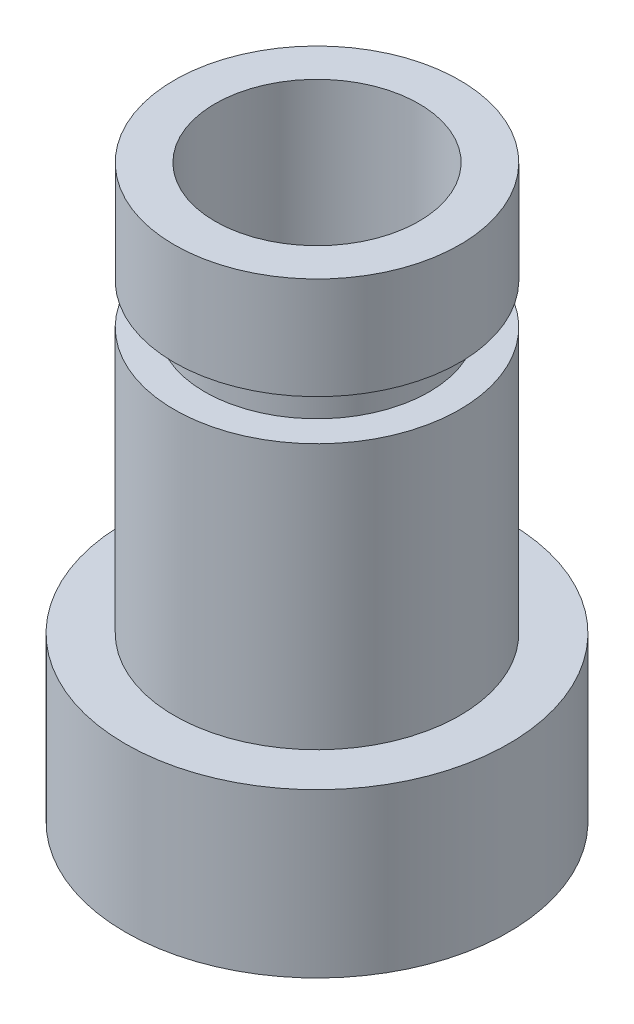
ISO-10303-21;
HEADER;
FILE_DESCRIPTION(('STEP AP214'),'2;1');
FILE_NAME('part.step','',(''),(''),'','','');
FILE_SCHEMA(('AUTOMOTIVE_DESIGN { 1 0 10303 214 1 1 1 1 }'));
ENDSEC;
DATA;
#1=APPLICATION_CONTEXT('core data for automotive mechanical design processes');
#2=APPLICATION_PROTOCOL_DEFINITION('international standard','automotive_design',2000,#1);
#3=PRODUCT_CONTEXT('',#1,'mechanical');
#4=PRODUCT('Part','Part','',(#3));
#5=PRODUCT_RELATED_PRODUCT_CATEGORY('part','',(#4));
#6=PRODUCT_DEFINITION_FORMATION('','',#4);
#7=PRODUCT_DEFINITION_CONTEXT('part definition',#1,'design');
#8=PRODUCT_DEFINITION('design','',#6,#7);
#9=PRODUCT_DEFINITION_SHAPE('','',#8);
#10=(LENGTH_UNIT() NAMED_UNIT(*) SI_UNIT(.MILLI.,.METRE.));
#11=(NAMED_UNIT(*) PLANE_ANGLE_UNIT() SI_UNIT($,.RADIAN.));
#12=(NAMED_UNIT(*) SI_UNIT($,.STERADIAN.) SOLID_ANGLE_UNIT());
#13=UNCERTAINTY_MEASURE_WITH_UNIT(LENGTH_MEASURE(1.E-05),#10,'distance_accuracy_value','');
#14=(GEOMETRIC_REPRESENTATION_CONTEXT(3) GLOBAL_UNCERTAINTY_ASSIGNED_CONTEXT((#13)) GLOBAL_UNIT_ASSIGNED_CONTEXT((#10,
#11,#12)) REPRESENTATION_CONTEXT('',''));
#15=CARTESIAN_POINT('',(0.,0.,0.));
#16=DIRECTION('',(0.,0.,1.));
#17=DIRECTION('',(1.,0.,0.));
#18=AXIS2_PLACEMENT_3D('',#15,#16,#17);
#19=CARTESIAN_POINT('',(0.,4.,0.));
#20=DIRECTION('',(0.,-1.,0.));
#21=DIRECTION('',(0.,0.,-1.));
#22=AXIS2_PLACEMENT_3D('',#19,#20,#21);
#23=CYLINDRICAL_SURFACE('',#22,4.7);
#24=CARTESIAN_POINT('',(0.,4.,0.));
#25=DIRECTION('',(0.,1.,0.));
#26=DIRECTION('',(0.,0.,1.));
#27=AXIS2_PLACEMENT_3D('',#24,#25,#26);
#28=CIRCLE('',#27,4.7);
#29=CARTESIAN_POINT('',(0.,4.,4.7));
#30=VERTEX_POINT('',#29);
#31=EDGE_CURVE('E10',#30,#30,#28,.T.);
#32=ORIENTED_EDGE('',*,*,#31,.F.);
#33=EDGE_LOOP('',(#32));
#34=FACE_BOUND('',#33,.T.);
#35=CARTESIAN_POINT('',(0.,0.,0.));
#36=DIRECTION('',(0.,1.,0.));
#37=DIRECTION('',(0.,0.,1.));
#38=AXIS2_PLACEMENT_3D('',#35,#36,#37);
#39=CIRCLE('',#38,4.7);
#40=CARTESIAN_POINT('',(0.,0.,4.7));
#41=VERTEX_POINT('',#40);
#42=EDGE_CURVE('E33',#41,#41,#39,.T.);
#43=ORIENTED_EDGE('',*,*,#42,.T.);
#44=EDGE_LOOP('',(#43));
#45=FACE_BOUND('',#44,.T.);
#46=ADVANCED_FACE('F30',(#34,#45),#23,.T.);
#47=CARTESIAN_POINT('',(0.,4.,0.));
#48=DIRECTION('',(0.,1.,0.));
#49=DIRECTION('',(0.,0.,1.));
#50=AXIS2_PLACEMENT_3D('',#47,#48,#49);
#51=PLANE('',#50);
#52=CARTESIAN_POINT('',(0.,4.,0.));
#53=DIRECTION('',(0.,1.,0.));
#54=DIRECTION('',(0.,0.,1.));
#55=AXIS2_PLACEMENT_3D('',#52,#53,#54);
#56=CIRCLE('',#55,3.5);
#57=CARTESIAN_POINT('',(0.,4.,-3.5));
#58=VERTEX_POINT('',#57);
#59=EDGE_CURVE('E42',#58,#58,#56,.T.);
#60=ORIENTED_EDGE('',*,*,#59,.F.);
#61=EDGE_LOOP('',(#60));
#62=FACE_BOUND('',#61,.T.);
#63=ORIENTED_EDGE('',*,*,#31,.T.);
#64=EDGE_LOOP('',(#63));
#65=FACE_BOUND('',#64,.T.);
#66=ADVANCED_FACE('F95',(#62,#65),#51,.T.);
#67=CARTESIAN_POINT('',(0.,0.,0.));
#68=DIRECTION('',(0.,1.,0.));
#69=DIRECTION('',(0.,0.,1.));
#70=AXIS2_PLACEMENT_3D('',#67,#68,#69);
#71=PLANE('',#70);
#72=CARTESIAN_POINT('',(0.,0.,0.));
#73=DIRECTION('',(0.,1.,0.));
#74=DIRECTION('',(0.,0.,1.));
#75=AXIS2_PLACEMENT_3D('',#72,#73,#74);
#76=CIRCLE('',#75,2.5);
#77=CARTESIAN_POINT('',(0.,0.,2.5));
#78=VERTEX_POINT('',#77);
#79=EDGE_CURVE('E57',#78,#78,#76,.T.);
#80=ORIENTED_EDGE('',*,*,#79,.T.);
#81=EDGE_LOOP('',(#80));
#82=FACE_BOUND('',#81,.T.);
#83=ORIENTED_EDGE('',*,*,#42,.F.);
#84=EDGE_LOOP('',(#83));
#85=FACE_BOUND('',#84,.T.);
#86=ADVANCED_FACE('F66',(#82,#85),#71,.F.);
#87=CARTESIAN_POINT('',(0.,10.5,0.));
#88=DIRECTION('',(0.,-1.,0.));
#89=DIRECTION('',(0.,0.,-1.));
#90=AXIS2_PLACEMENT_3D('',#87,#88,#89);
#91=CYLINDRICAL_SURFACE('',#90,3.5);
#92=CARTESIAN_POINT('',(0.,10.5,0.));
#93=DIRECTION('',(0.,1.,0.));
#94=DIRECTION('',(0.,0.,1.));
#95=AXIS2_PLACEMENT_3D('',#92,#93,#94);
#96=CIRCLE('',#95,3.5);
#97=CARTESIAN_POINT('',(0.,10.5,-3.5));
#98=VERTEX_POINT('',#97);
#99=EDGE_CURVE('E40',#98,#98,#96,.T.);
#100=CARTESIAN_POINT('',(0.,10.5,-3.5));
#101=CARTESIAN_POINT('',(0.,10.4322916666667,-3.5));
#102=CARTESIAN_POINT('',(0.,10.3645833333333,-3.5));
#103=CARTESIAN_POINT('',(0.,10.2291666666667,-3.5));
#104=CARTESIAN_POINT('',(0.,10.1614583333333,-3.5));
#105=CARTESIAN_POINT('',(0.,10.0260416666667,-3.5));
#106=CARTESIAN_POINT('',(0.,9.95833333333333,-3.5));
#107=CARTESIAN_POINT('',(0.,9.82291666666667,-3.5));
#108=CARTESIAN_POINT('',(0.,9.75520833333333,-3.5));
#109=CARTESIAN_POINT('',(0.,9.61979166666667,-3.5));
#110=CARTESIAN_POINT('',(0.,9.55208333333333,-3.5));
#111=CARTESIAN_POINT('',(0.,9.41666666666667,-3.5));
#112=CARTESIAN_POINT('',(0.,9.34895833333333,-3.5));
#113=CARTESIAN_POINT('',(0.,9.21354166666666,-3.5));
#114=CARTESIAN_POINT('',(0.,9.14583333333333,-3.5));
#115=CARTESIAN_POINT('',(0.,9.01041666666666,-3.5));
#116=CARTESIAN_POINT('',(0.,8.94270833333333,-3.5));
#117=CARTESIAN_POINT('',(0.,8.80729166666666,-3.5));
#118=CARTESIAN_POINT('',(0.,8.73958333333333,-3.5));
#119=CARTESIAN_POINT('',(0.,8.60416666666667,-3.5));
#120=CARTESIAN_POINT('',(0.,8.53645833333333,-3.5));
#121=CARTESIAN_POINT('',(0.,8.40104166666667,-3.5));
#122=CARTESIAN_POINT('',(0.,8.33333333333333,-3.5));
#123=CARTESIAN_POINT('',(0.,8.19791666666667,-3.5));
#124=CARTESIAN_POINT('',(0.,8.13020833333333,-3.5));
#125=CARTESIAN_POINT('',(0.,7.99479166666667,-3.5));
#126=CARTESIAN_POINT('',(0.,7.92708333333333,-3.5));
#127=CARTESIAN_POINT('',(0.,7.79166666666666,-3.5));
#128=CARTESIAN_POINT('',(0.,7.72395833333333,-3.5));
#129=CARTESIAN_POINT('',(0.,7.58854166666667,-3.5));
#130=CARTESIAN_POINT('',(0.,7.52083333333333,-3.5));
#131=CARTESIAN_POINT('',(0.,7.38541666666667,-3.5));
#132=CARTESIAN_POINT('',(0.,7.31770833333333,-3.5));
#133=CARTESIAN_POINT('',(0.,7.18229166666667,-3.5));
#134=CARTESIAN_POINT('',(0.,7.11458333333333,-3.5));
#135=CARTESIAN_POINT('',(0.,6.97916666666667,-3.5));
#136=CARTESIAN_POINT('',(0.,6.91145833333333,-3.5));
#137=CARTESIAN_POINT('',(0.,6.77604166666667,-3.5));
#138=CARTESIAN_POINT('',(0.,6.70833333333333,-3.5));
#139=CARTESIAN_POINT('',(0.,6.57291666666667,-3.5));
#140=CARTESIAN_POINT('',(0.,6.50520833333333,-3.5));
#141=CARTESIAN_POINT('',(0.,6.36979166666667,-3.5));
#142=CARTESIAN_POINT('',(0.,6.30208333333333,-3.5));
#143=CARTESIAN_POINT('',(0.,6.16666666666667,-3.5));
#144=CARTESIAN_POINT('',(0.,6.09895833333333,-3.5));
#145=CARTESIAN_POINT('',(0.,5.96354166666667,-3.5));
#146=CARTESIAN_POINT('',(0.,5.89583333333333,-3.5));
#147=CARTESIAN_POINT('',(0.,5.76041666666667,-3.5));
#148=CARTESIAN_POINT('',(0.,5.69270833333333,-3.5));
#149=CARTESIAN_POINT('',(0.,5.55729166666667,-3.5));
#150=CARTESIAN_POINT('',(0.,5.48958333333333,-3.5));
#151=CARTESIAN_POINT('',(0.,5.35416666666667,-3.5));
#152=CARTESIAN_POINT('',(0.,5.28645833333333,-3.5));
#153=CARTESIAN_POINT('',(0.,5.15104166666667,-3.5));
#154=CARTESIAN_POINT('',(0.,5.08333333333333,-3.5));
#155=CARTESIAN_POINT('',(0.,4.94791666666667,-3.5));
#156=CARTESIAN_POINT('',(0.,4.88020833333333,-3.5));
#157=CARTESIAN_POINT('',(0.,4.74479166666667,-3.5));
#158=CARTESIAN_POINT('',(0.,4.67708333333333,-3.5));
#159=CARTESIAN_POINT('',(0.,4.54166666666667,-3.5));
#160=CARTESIAN_POINT('',(0.,4.47395833333333,-3.5));
#161=CARTESIAN_POINT('',(0.,4.33854166666667,-3.5));
#162=CARTESIAN_POINT('',(0.,4.27083333333333,-3.5));
#163=CARTESIAN_POINT('',(0.,4.13541666666667,-3.5));
#164=CARTESIAN_POINT('',(0.,4.06770833333333,-3.5));
#165=CARTESIAN_POINT('',(0.,4.,-3.5));
#166=B_SPLINE_CURVE_WITH_KNOTS('',3,(#100,#101,#102,#103,#104,#105,#106,#107,#108,#109,#110,
#111,#112,#113,#114,#115,#116,#117,#118,#119,#120,#121,#122,#123,#124,#125,#126,#127,#128,#129,
#130,#131,#132,#133,#134,#135,#136,#137,#138,#139,#140,#141,#142,#143,#144,#145,#146,#147,#148,
#149,#150,#151,#152,#153,#154,#155,#156,#157,#158,#159,#160,#161,#162,#163,#164,#165),
.UNSPECIFIED.,.F.,.F.,(4,2,2,2,2,2,2,2,2,2,2,2,2,2,2,2,2,2,2,2,2,2,2,2,2,2,2,2,2,2,2,2,4),(0.,
0.203125,0.40625,0.609375000000001,0.812500000000001,1.015625,1.21875,1.421875,1.625,1.828125,
2.03125,2.234375,2.4375,2.640625,2.84375,3.046875,3.25,3.453125,3.65625,3.859375,4.0625,
4.265625,4.46875,4.671875,4.875,5.078125,5.28125,5.484375,5.6875,5.890625,6.09375,6.296875,6.5),.UNSPECIFIED.);
#167=EDGE_CURVE('BSEAM105',#98,#58,#166,.T.);
#168=ORIENTED_EDGE('',*,*,#99,.F.);
#169=ORIENTED_EDGE('',*,*,#59,.T.);
#170=ORIENTED_EDGE('',*,*,#167,.T.);
#171=ORIENTED_EDGE('',*,*,#167,.F.);
#172=EDGE_LOOP('',(#168,#170,#169,#171));
#173=FACE_BOUND('',#172,.T.);
#174=ADVANCED_FACE('F105',(#173),#91,.T.);
#175=CARTESIAN_POINT('',(0.,10.5,0.));
#176=DIRECTION('',(0.,1.,0.));
#177=DIRECTION('',(0.,0.,1.));
#178=AXIS2_PLACEMENT_3D('',#175,#176,#177);
#179=PLANE('',#178);
#180=CARTESIAN_POINT('',(0.,10.5,0.));
#181=DIRECTION('',(0.,1.,0.));
#182=DIRECTION('',(0.,0.,1.));
#183=AXIS2_PLACEMENT_3D('',#180,#181,#182);
#184=CIRCLE('',#183,2.75);
#185=CARTESIAN_POINT('',(0.,10.5,2.75));
#186=VERTEX_POINT('',#185);
#187=EDGE_CURVE('E48',#186,#186,#184,.T.);
#188=ORIENTED_EDGE('',*,*,#187,.F.);
#189=EDGE_LOOP('',(#188));
#190=FACE_BOUND('',#189,.T.);
#191=ORIENTED_EDGE('',*,*,#99,.T.);
#192=EDGE_LOOP('',(#191));
#193=FACE_BOUND('',#192,.T.);
#194=ADVANCED_FACE('F109',(#190,#193),#179,.T.);
#195=CARTESIAN_POINT('',(0.,11.5,0.));
#196=DIRECTION('',(0.,-1.,0.));
#197=DIRECTION('',(0.,0.,-1.));
#198=AXIS2_PLACEMENT_3D('',#195,#196,#197);
#199=CYLINDRICAL_SURFACE('',#198,2.75);
#200=CARTESIAN_POINT('',(0.,11.5,0.));
#201=DIRECTION('',(0.,1.,0.));
#202=DIRECTION('',(0.,0.,1.));
#203=AXIS2_PLACEMENT_3D('',#200,#201,#202);
#204=CIRCLE('',#203,2.75);
#205=CARTESIAN_POINT('',(0.,11.5,2.75));
#206=VERTEX_POINT('',#205);
#207=EDGE_CURVE('E45',#206,#206,#204,.T.);
#208=ORIENTED_EDGE('',*,*,#207,.F.);
#209=EDGE_LOOP('',(#208));
#210=FACE_BOUND('',#209,.T.);
#211=ORIENTED_EDGE('',*,*,#187,.T.);
#212=EDGE_LOOP('',(#211));
#213=FACE_BOUND('',#212,.T.);
#214=ADVANCED_FACE('F85',(#210,#213),#199,.T.);
#215=CARTESIAN_POINT('',(0.,14.,0.));
#216=DIRECTION('',(0.,-1.,0.));
#217=DIRECTION('',(0.,0.,-1.));
#218=AXIS2_PLACEMENT_3D('',#215,#216,#217);
#219=CYLINDRICAL_SURFACE('',#218,3.5);
#220=CARTESIAN_POINT('',(0.,14.,0.));
#221=DIRECTION('',(0.,1.,0.));
#222=DIRECTION('',(0.,0.,1.));
#223=AXIS2_PLACEMENT_3D('',#220,#221,#222);
#224=CIRCLE('',#223,3.5);
#225=CARTESIAN_POINT('',(0.,14.,3.5));
#226=VERTEX_POINT('',#225);
#227=EDGE_CURVE('E51',#226,#226,#224,.T.);
#228=ORIENTED_EDGE('',*,*,#227,.F.);
#229=EDGE_LOOP('',(#228));
#230=FACE_BOUND('',#229,.T.);
#231=CARTESIAN_POINT('',(0.,11.5,0.));
#232=DIRECTION('',(0.,1.,0.));
#233=DIRECTION('',(0.,0.,1.));
#234=AXIS2_PLACEMENT_3D('',#231,#232,#233);
#235=CIRCLE('',#234,3.5);
#236=CARTESIAN_POINT('',(0.,11.5,3.5));
#237=VERTEX_POINT('',#236);
#238=EDGE_CURVE('E54',#237,#237,#235,.T.);
#239=ORIENTED_EDGE('',*,*,#238,.T.);
#240=EDGE_LOOP('',(#239));
#241=FACE_BOUND('',#240,.T.);
#242=ADVANCED_FACE('F79',(#230,#241),#219,.T.);
#243=CARTESIAN_POINT('',(0.,14.,0.));
#244=DIRECTION('',(0.,1.,0.));
#245=DIRECTION('',(0.,0.,1.));
#246=AXIS2_PLACEMENT_3D('',#243,#244,#245);
#247=PLANE('',#246);
#248=CARTESIAN_POINT('',(0.,14.,0.));
#249=DIRECTION('',(0.,1.,0.));
#250=DIRECTION('',(0.,0.,1.));
#251=AXIS2_PLACEMENT_3D('',#248,#249,#250);
#252=CIRCLE('',#251,2.5);
#253=CARTESIAN_POINT('',(0.,14.,2.5));
#254=VERTEX_POINT('',#253);
#255=EDGE_CURVE('E60',#254,#254,#252,.T.);
#256=ORIENTED_EDGE('',*,*,#255,.F.);
#257=EDGE_LOOP('',(#256));
#258=FACE_BOUND('',#257,.T.);
#259=ORIENTED_EDGE('',*,*,#227,.T.);
#260=EDGE_LOOP('',(#259));
#261=FACE_BOUND('',#260,.T.);
#262=ADVANCED_FACE('F76',(#258,#261),#247,.T.);
#263=CARTESIAN_POINT('',(0.,11.5,0.));
#264=DIRECTION('',(0.,1.,0.));
#265=DIRECTION('',(0.,0.,1.));
#266=AXIS2_PLACEMENT_3D('',#263,#264,#265);
#267=PLANE('',#266);
#268=ORIENTED_EDGE('',*,*,#207,.T.);
#269=EDGE_LOOP('',(#268));
#270=FACE_BOUND('',#269,.T.);
#271=ORIENTED_EDGE('',*,*,#238,.F.);
#272=EDGE_LOOP('',(#271));
#273=FACE_BOUND('',#272,.T.);
#274=ADVANCED_FACE('F72',(#270,#273),#267,.F.);
#275=CARTESIAN_POINT('',(0.,0.,0.));
#276=DIRECTION('',(0.,1.,0.));
#277=DIRECTION('',(0.,0.,1.));
#278=AXIS2_PLACEMENT_3D('',#275,#276,#277);
#279=CYLINDRICAL_SURFACE('',#278,2.5);
#280=ORIENTED_EDGE('',*,*,#79,.F.);
#281=EDGE_LOOP('',(#280));
#282=FACE_BOUND('',#281,.T.);
#283=ORIENTED_EDGE('',*,*,#255,.T.);
#284=EDGE_LOOP('',(#283));
#285=FACE_BOUND('',#284,.T.);
#286=ADVANCED_FACE('F69',(#282,#285),#279,.F.);
#287=CLOSED_SHELL('',(#46,#66,#86,#174,#194,#214,#242,#262,#274,#286));
#288=MANIFOLD_SOLID_BREP('B2',#287);
#289=ADVANCED_BREP_SHAPE_REPRESENTATION('',(#18,#288),#14);
#290=SHAPE_DEFINITION_REPRESENTATION(#9,#289);
ENDSEC;
END-ISO-10303-21;
